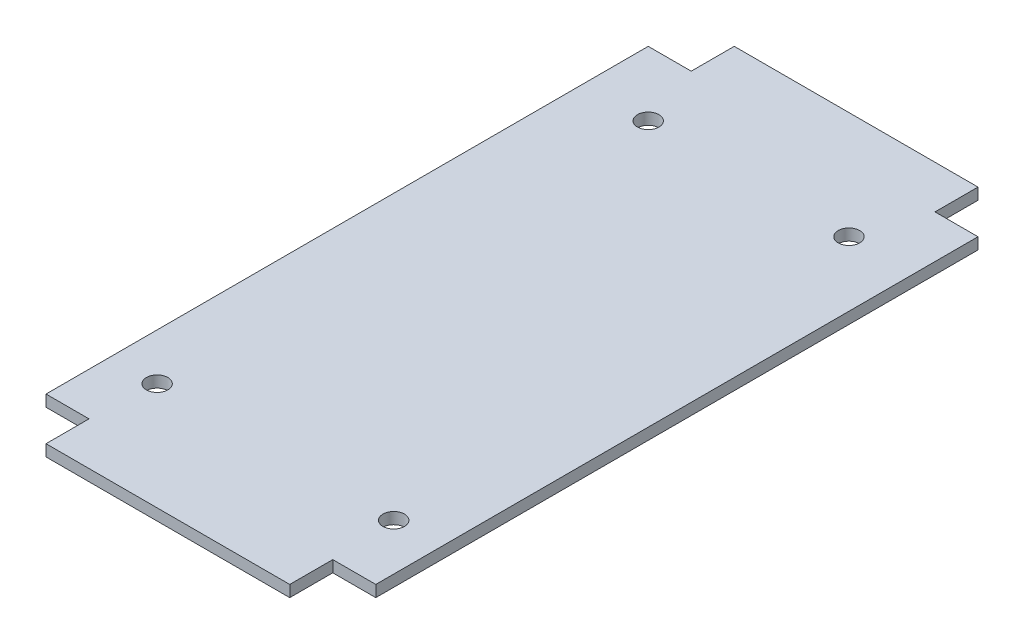
ISO-10303-21;
HEADER;
FILE_DESCRIPTION(('STEP AP214'),'2;1');
FILE_NAME('part.step','',(''),(''),'','','');
FILE_SCHEMA(('AUTOMOTIVE_DESIGN { 1 0 10303 214 1 1 1 1 }'));
ENDSEC;
DATA;
#1=APPLICATION_CONTEXT('core data for automotive mechanical design processes');
#2=APPLICATION_PROTOCOL_DEFINITION('international standard','automotive_design',2000,#1);
#3=PRODUCT_CONTEXT('',#1,'mechanical');
#4=PRODUCT('Part','Part','',(#3));
#5=PRODUCT_RELATED_PRODUCT_CATEGORY('part','',(#4));
#6=PRODUCT_DEFINITION_FORMATION('','',#4);
#7=PRODUCT_DEFINITION_CONTEXT('part definition',#1,'design');
#8=PRODUCT_DEFINITION('design','',#6,#7);
#9=PRODUCT_DEFINITION_SHAPE('','',#8);
#10=(LENGTH_UNIT() NAMED_UNIT(*) SI_UNIT(.MILLI.,.METRE.));
#11=(NAMED_UNIT(*) PLANE_ANGLE_UNIT() SI_UNIT($,.RADIAN.));
#12=(NAMED_UNIT(*) SI_UNIT($,.STERADIAN.) SOLID_ANGLE_UNIT());
#13=UNCERTAINTY_MEASURE_WITH_UNIT(LENGTH_MEASURE(1.E-05),#10,'distance_accuracy_value','');
#14=(GEOMETRIC_REPRESENTATION_CONTEXT(3) GLOBAL_UNCERTAINTY_ASSIGNED_CONTEXT((#13)) GLOBAL_UNIT_ASSIGNED_CONTEXT((#10,
#11,#12)) REPRESENTATION_CONTEXT('',''));
#15=CARTESIAN_POINT('',(0.,0.,0.));
#16=DIRECTION('',(0.,0.,1.));
#17=DIRECTION('',(1.,0.,0.));
#18=AXIS2_PLACEMENT_3D('',#15,#16,#17);
#19=CARTESIAN_POINT('',(17.,0.,-42.));
#20=DIRECTION('',(0.,-1.,0.));
#21=DIRECTION('',(0.,0.,-1.));
#22=AXIS2_PLACEMENT_3D('',#19,#20,#21);
#23=PLANE('',#22);
#24=DIRECTION('',(0.,0.,-1.));
#25=VECTOR('',#24,1.);
#26=CARTESIAN_POINT('',(17.,0.,-42.));
#27=LINE('',#26,#25);
#28=CARTESIAN_POINT('',(17.,0.,-48.));
#29=VERTEX_POINT('',#28);
#30=CARTESIAN_POINT('',(17.,0.,-42.));
#31=VERTEX_POINT('',#30);
#32=EDGE_CURVE('E367',#29,#31,#27,.F.);
#33=ORIENTED_EDGE('',*,*,#32,.F.);
#34=DIRECTION('',(-1.,0.,0.));
#35=VECTOR('',#34,1.);
#36=CARTESIAN_POINT('',(-17.,0.,-48.));
#37=LINE('',#36,#35);
#38=CARTESIAN_POINT('',(-17.,0.,-48.));
#39=VERTEX_POINT('',#38);
#40=EDGE_CURVE('E372',#39,#29,#37,.F.);
#41=ORIENTED_EDGE('',*,*,#40,.F.);
#42=DIRECTION('',(0.,0.,1.));
#43=VECTOR('',#42,1.);
#44=CARTESIAN_POINT('',(-17.,0.,-42.));
#45=LINE('',#44,#43);
#46=CARTESIAN_POINT('',(-17.,0.,-42.));
#47=VERTEX_POINT('',#46);
#48=EDGE_CURVE('E377',#47,#39,#45,.F.);
#49=ORIENTED_EDGE('',*,*,#48,.F.);
#50=DIRECTION('',(-1.,0.,0.));
#51=VECTOR('',#50,1.);
#52=CARTESIAN_POINT('',(-23.,0.,-42.));
#53=LINE('',#52,#51);
#54=CARTESIAN_POINT('',(-23.,0.,-42.));
#55=VERTEX_POINT('',#54);
#56=EDGE_CURVE('E383',#55,#47,#53,.F.);
#57=ORIENTED_EDGE('',*,*,#56,.F.);
#58=DIRECTION('',(0.,0.,1.));
#59=VECTOR('',#58,1.);
#60=CARTESIAN_POINT('',(-23.,0.,-42.));
#61=LINE('',#60,#59);
#62=CARTESIAN_POINT('',(-23.,0.,42.));
#63=VERTEX_POINT('',#62);
#64=EDGE_CURVE('E389',#63,#55,#61,.F.);
#65=ORIENTED_EDGE('',*,*,#64,.F.);
#66=DIRECTION('',(1.,0.,0.));
#67=VECTOR('',#66,1.);
#68=CARTESIAN_POINT('',(-23.,0.,42.));
#69=LINE('',#68,#67);
#70=CARTESIAN_POINT('',(-17.,0.,42.));
#71=VERTEX_POINT('',#70);
#72=EDGE_CURVE('E395',#71,#63,#69,.F.);
#73=ORIENTED_EDGE('',*,*,#72,.F.);
#74=DIRECTION('',(0.,0.,1.));
#75=VECTOR('',#74,1.);
#76=CARTESIAN_POINT('',(-17.,0.,42.));
#77=LINE('',#76,#75);
#78=CARTESIAN_POINT('',(-17.,0.,48.));
#79=VERTEX_POINT('',#78);
#80=EDGE_CURVE('E401',#79,#71,#77,.F.);
#81=ORIENTED_EDGE('',*,*,#80,.F.);
#82=DIRECTION('',(1.,0.,0.));
#83=VECTOR('',#82,1.);
#84=CARTESIAN_POINT('',(-17.,0.,48.));
#85=LINE('',#84,#83);
#86=CARTESIAN_POINT('',(17.,0.,48.));
#87=VERTEX_POINT('',#86);
#88=EDGE_CURVE('E407',#87,#79,#85,.F.);
#89=ORIENTED_EDGE('',*,*,#88,.F.);
#90=DIRECTION('',(0.,0.,-1.));
#91=VECTOR('',#90,1.);
#92=CARTESIAN_POINT('',(17.,0.,42.));
#93=LINE('',#92,#91);
#94=CARTESIAN_POINT('',(17.,0.,42.));
#95=VERTEX_POINT('',#94);
#96=EDGE_CURVE('E411',#95,#87,#93,.F.);
#97=ORIENTED_EDGE('',*,*,#96,.F.);
#98=DIRECTION('',(1.,0.,0.));
#99=VECTOR('',#98,1.);
#100=CARTESIAN_POINT('',(23.,0.,42.));
#101=LINE('',#100,#99);
#102=CARTESIAN_POINT('',(23.,0.,42.));
#103=VERTEX_POINT('',#102);
#104=EDGE_CURVE('E104',#103,#95,#101,.F.);
#105=ORIENTED_EDGE('',*,*,#104,.F.);
#106=DIRECTION('',(0.,0.,-1.));
#107=VECTOR('',#106,1.);
#108=CARTESIAN_POINT('',(23.,0.,-42.));
#109=LINE('',#108,#107);
#110=CARTESIAN_POINT('',(23.,0.,-42.));
#111=VERTEX_POINT('',#110);
#112=EDGE_CURVE('E106',#111,#103,#109,.F.);
#113=ORIENTED_EDGE('',*,*,#112,.F.);
#114=DIRECTION('',(-1.,0.,0.));
#115=VECTOR('',#114,1.);
#116=CARTESIAN_POINT('',(23.,0.,-42.));
#117=LINE('',#116,#115);
#118=EDGE_CURVE('E109',#31,#111,#117,.F.);
#119=ORIENTED_EDGE('',*,*,#118,.F.);
#120=EDGE_LOOP('',(#33,#41,#49,#57,#65,#73,#81,#89,#97,#105,#113,#119));
#121=FACE_BOUND('',#120,.T.);
#122=CARTESIAN_POINT('',(-14.,0.,-33.));
#123=DIRECTION('',(0.,1.,0.));
#124=DIRECTION('',(0.,0.,1.));
#125=AXIS2_PLACEMENT_3D('',#122,#123,#124);
#126=CIRCLE('',#125,1.5);
#127=CARTESIAN_POINT('',(-14.,0.,-31.5));
#128=VERTEX_POINT('',#127);
#129=EDGE_CURVE('E122',#128,#128,#126,.F.);
#130=ORIENTED_EDGE('',*,*,#129,.T.);
#131=EDGE_LOOP('',(#130));
#132=FACE_BOUND('',#131,.T.);
#133=CARTESIAN_POINT('',(-16.5,0.,33.));
#134=DIRECTION('',(0.,1.,0.));
#135=DIRECTION('',(0.,0.,1.));
#136=AXIS2_PLACEMENT_3D('',#133,#134,#135);
#137=CIRCLE('',#136,1.5);
#138=CARTESIAN_POINT('',(-16.5,0.,34.5));
#139=VERTEX_POINT('',#138);
#140=EDGE_CURVE('E148',#139,#139,#137,.F.);
#141=ORIENTED_EDGE('',*,*,#140,.T.);
#142=EDGE_LOOP('',(#141));
#143=FACE_BOUND('',#142,.T.);
#144=CARTESIAN_POINT('',(16.5,0.,33.));
#145=DIRECTION('',(0.,1.,0.));
#146=DIRECTION('',(0.,0.,1.));
#147=AXIS2_PLACEMENT_3D('',#144,#145,#146);
#148=CIRCLE('',#147,1.5);
#149=CARTESIAN_POINT('',(16.5,0.,34.5));
#150=VERTEX_POINT('',#149);
#151=EDGE_CURVE('E150',#150,#150,#148,.F.);
#152=ORIENTED_EDGE('',*,*,#151,.T.);
#153=EDGE_LOOP('',(#152));
#154=FACE_BOUND('',#153,.T.);
#155=CARTESIAN_POINT('',(14.,0.,-33.));
#156=DIRECTION('',(0.,1.,0.));
#157=DIRECTION('',(0.,0.,1.));
#158=AXIS2_PLACEMENT_3D('',#155,#156,#157);
#159=CIRCLE('',#158,1.5);
#160=CARTESIAN_POINT('',(14.,0.,-31.5));
#161=VERTEX_POINT('',#160);
#162=EDGE_CURVE('E20',#161,#161,#159,.F.);
#163=ORIENTED_EDGE('',*,*,#162,.T.);
#164=EDGE_LOOP('',(#163));
#165=FACE_BOUND('',#164,.T.);
#166=ADVANCED_FACE('F17',(#121,#132,#143,#154,#165),#23,.F.);
#167=CARTESIAN_POINT('',(14.,-1.6,-33.));
#168=DIRECTION('',(0.,1.,0.));
#169=DIRECTION('',(0.,0.,1.));
#170=AXIS2_PLACEMENT_3D('',#167,#168,#169);
#171=CYLINDRICAL_SURFACE('',#170,1.5);
#172=ORIENTED_EDGE('',*,*,#162,.F.);
#173=EDGE_LOOP('',(#172));
#174=FACE_BOUND('',#173,.T.);
#175=CARTESIAN_POINT('',(14.,-1.6,-33.));
#176=DIRECTION('',(0.,1.,0.));
#177=DIRECTION('',(0.,0.,1.));
#178=AXIS2_PLACEMENT_3D('',#175,#176,#177);
#179=CIRCLE('',#178,1.5);
#180=CARTESIAN_POINT('',(14.,-1.6,-31.5));
#181=VERTEX_POINT('',#180);
#182=EDGE_CURVE('E143',#181,#181,#179,.T.);
#183=ORIENTED_EDGE('',*,*,#182,.F.);
#184=EDGE_LOOP('',(#183));
#185=FACE_BOUND('',#184,.T.);
#186=ADVANCED_FACE('F158',(#174,#185),#171,.F.);
#187=CARTESIAN_POINT('',(16.5,-1.6,33.));
#188=DIRECTION('',(0.,1.,0.));
#189=DIRECTION('',(0.,0.,1.));
#190=AXIS2_PLACEMENT_3D('',#187,#188,#189);
#191=CYLINDRICAL_SURFACE('',#190,1.5);
#192=ORIENTED_EDGE('',*,*,#151,.F.);
#193=EDGE_LOOP('',(#192));
#194=FACE_BOUND('',#193,.T.);
#195=CARTESIAN_POINT('',(16.5,-1.6,33.));
#196=DIRECTION('',(0.,1.,0.));
#197=DIRECTION('',(0.,0.,1.));
#198=AXIS2_PLACEMENT_3D('',#195,#196,#197);
#199=CIRCLE('',#198,1.5);
#200=CARTESIAN_POINT('',(16.5,-1.6,34.5));
#201=VERTEX_POINT('',#200);
#202=EDGE_CURVE('E140',#201,#201,#199,.T.);
#203=ORIENTED_EDGE('',*,*,#202,.F.);
#204=EDGE_LOOP('',(#203));
#205=FACE_BOUND('',#204,.T.);
#206=ADVANCED_FACE('F161',(#194,#205),#191,.F.);
#207=CARTESIAN_POINT('',(-16.5,-1.6,33.));
#208=DIRECTION('',(0.,1.,0.));
#209=DIRECTION('',(0.,0.,1.));
#210=AXIS2_PLACEMENT_3D('',#207,#208,#209);
#211=CYLINDRICAL_SURFACE('',#210,1.5);
#212=ORIENTED_EDGE('',*,*,#140,.F.);
#213=EDGE_LOOP('',(#212));
#214=FACE_BOUND('',#213,.T.);
#215=CARTESIAN_POINT('',(-16.5,-1.6,33.));
#216=DIRECTION('',(0.,1.,0.));
#217=DIRECTION('',(0.,0.,1.));
#218=AXIS2_PLACEMENT_3D('',#215,#216,#217);
#219=CIRCLE('',#218,1.5);
#220=CARTESIAN_POINT('',(-16.5,-1.6,34.5));
#221=VERTEX_POINT('',#220);
#222=EDGE_CURVE('E137',#221,#221,#219,.T.);
#223=ORIENTED_EDGE('',*,*,#222,.F.);
#224=EDGE_LOOP('',(#223));
#225=FACE_BOUND('',#224,.T.);
#226=ADVANCED_FACE('F220',(#214,#225),#211,.F.);
#227=CARTESIAN_POINT('',(-14.,-1.6,-33.));
#228=DIRECTION('',(0.,1.,0.));
#229=DIRECTION('',(0.,0.,1.));
#230=AXIS2_PLACEMENT_3D('',#227,#228,#229);
#231=CYLINDRICAL_SURFACE('',#230,1.5);
#232=ORIENTED_EDGE('',*,*,#129,.F.);
#233=EDGE_LOOP('',(#232));
#234=FACE_BOUND('',#233,.T.);
#235=CARTESIAN_POINT('',(-14.,-1.6,-33.));
#236=DIRECTION('',(0.,1.,0.));
#237=DIRECTION('',(0.,0.,1.));
#238=AXIS2_PLACEMENT_3D('',#235,#236,#237);
#239=CIRCLE('',#238,1.5);
#240=CARTESIAN_POINT('',(-14.,-1.6,-31.5));
#241=VERTEX_POINT('',#240);
#242=EDGE_CURVE('E133',#241,#241,#239,.T.);
#243=ORIENTED_EDGE('',*,*,#242,.F.);
#244=EDGE_LOOP('',(#243));
#245=FACE_BOUND('',#244,.T.);
#246=ADVANCED_FACE('F217',(#234,#245),#231,.F.);
#247=CARTESIAN_POINT('',(23.,-1.6,-42.));
#248=DIRECTION('',(0.,0.,-1.));
#249=DIRECTION('',(-1.,0.,0.));
#250=AXIS2_PLACEMENT_3D('',#247,#248,#249);
#251=PLANE('',#250);
#252=DIRECTION('',(1.,0.,0.));
#253=VECTOR('',#252,1.);
#254=CARTESIAN_POINT('',(17.,-1.6,-42.));
#255=LINE('',#254,#253);
#256=CARTESIAN_POINT('',(17.,-1.6,-42.));
#257=VERTEX_POINT('',#256);
#258=CARTESIAN_POINT('',(23.,-1.6,-42.));
#259=VERTEX_POINT('',#258);
#260=EDGE_CURVE('E136',#257,#259,#255,.T.);
#261=ORIENTED_EDGE('',*,*,#260,.F.);
#262=DIRECTION('',(0.,1.,0.));
#263=VECTOR('',#262,1.);
#264=CARTESIAN_POINT('',(17.,-1.6,-42.));
#265=LINE('',#264,#263);
#266=EDGE_CURVE('E120',#31,#257,#265,.F.);
#267=ORIENTED_EDGE('',*,*,#266,.F.);
#268=ORIENTED_EDGE('',*,*,#118,.T.);
#269=DIRECTION('',(0.,1.,0.));
#270=VECTOR('',#269,1.);
#271=CARTESIAN_POINT('',(23.,-1.6,-42.));
#272=LINE('',#271,#270);
#273=EDGE_CURVE('E114',#259,#111,#272,.T.);
#274=ORIENTED_EDGE('',*,*,#273,.F.);
#275=EDGE_LOOP('',(#261,#267,#268,#274));
#276=FACE_BOUND('',#275,.T.);
#277=ADVANCED_FACE('F117',(#276),#251,.T.);
#278=CARTESIAN_POINT('',(23.,-1.6,-42.));
#279=DIRECTION('',(1.,0.,0.));
#280=DIRECTION('',(0.,0.,-1.));
#281=AXIS2_PLACEMENT_3D('',#278,#279,#280);
#282=PLANE('',#281);
#283=DIRECTION('',(0.,0.,-1.));
#284=VECTOR('',#283,1.);
#285=CARTESIAN_POINT('',(23.,-1.6,-42.));
#286=LINE('',#285,#284);
#287=CARTESIAN_POINT('',(23.,-1.6,42.));
#288=VERTEX_POINT('',#287);
#289=EDGE_CURVE('E126',#259,#288,#286,.F.);
#290=ORIENTED_EDGE('',*,*,#289,.F.);
#291=ORIENTED_EDGE('',*,*,#273,.T.);
#292=ORIENTED_EDGE('',*,*,#112,.T.);
#293=DIRECTION('',(0.,1.,0.));
#294=VECTOR('',#293,1.);
#295=CARTESIAN_POINT('',(23.,-1.6,42.));
#296=LINE('',#295,#294);
#297=EDGE_CURVE('E129',#288,#103,#296,.T.);
#298=ORIENTED_EDGE('',*,*,#297,.F.);
#299=EDGE_LOOP('',(#290,#291,#292,#298));
#300=FACE_BOUND('',#299,.T.);
#301=ADVANCED_FACE('F124',(#300),#282,.T.);
#302=CARTESIAN_POINT('',(23.,-1.6,42.));
#303=DIRECTION('',(0.,0.,1.));
#304=DIRECTION('',(1.,0.,0.));
#305=AXIS2_PLACEMENT_3D('',#302,#303,#304);
#306=PLANE('',#305);
#307=DIRECTION('',(1.,0.,0.));
#308=VECTOR('',#307,1.);
#309=CARTESIAN_POINT('',(17.,-1.6,42.));
#310=LINE('',#309,#308);
#311=CARTESIAN_POINT('',(17.,-1.6,42.));
#312=VERTEX_POINT('',#311);
#313=EDGE_CURVE('E354',#288,#312,#310,.F.);
#314=ORIENTED_EDGE('',*,*,#313,.F.);
#315=ORIENTED_EDGE('',*,*,#297,.T.);
#316=ORIENTED_EDGE('',*,*,#104,.T.);
#317=DIRECTION('',(0.,1.,0.));
#318=VECTOR('',#317,1.);
#319=CARTESIAN_POINT('',(17.,-1.6,42.));
#320=LINE('',#319,#318);
#321=EDGE_CURVE('E356',#312,#95,#320,.T.);
#322=ORIENTED_EDGE('',*,*,#321,.F.);
#323=EDGE_LOOP('',(#314,#315,#316,#322));
#324=FACE_BOUND('',#323,.T.);
#325=ADVANCED_FACE('F208',(#324),#306,.T.);
#326=CARTESIAN_POINT('',(17.,-1.6,42.));
#327=DIRECTION('',(1.,0.,0.));
#328=DIRECTION('',(0.,0.,-1.));
#329=AXIS2_PLACEMENT_3D('',#326,#327,#328);
#330=PLANE('',#329);
#331=DIRECTION('',(0.,0.,-1.));
#332=VECTOR('',#331,1.);
#333=CARTESIAN_POINT('',(17.,-1.6,-42.));
#334=LINE('',#333,#332);
#335=CARTESIAN_POINT('',(17.,-1.6,48.));
#336=VERTEX_POINT('',#335);
#337=EDGE_CURVE('E359',#312,#336,#334,.F.);
#338=ORIENTED_EDGE('',*,*,#337,.F.);
#339=ORIENTED_EDGE('',*,*,#321,.T.);
#340=ORIENTED_EDGE('',*,*,#96,.T.);
#341=DIRECTION('',(0.,1.,0.));
#342=VECTOR('',#341,1.);
#343=CARTESIAN_POINT('',(17.,-1.6,48.));
#344=LINE('',#343,#342);
#345=EDGE_CURVE('E404',#336,#87,#344,.T.);
#346=ORIENTED_EDGE('',*,*,#345,.F.);
#347=EDGE_LOOP('',(#338,#339,#340,#346));
#348=FACE_BOUND('',#347,.T.);
#349=ADVANCED_FACE('F204',(#348),#330,.T.);
#350=CARTESIAN_POINT('',(-17.,-1.6,48.));
#351=DIRECTION('',(0.,0.,1.));
#352=DIRECTION('',(1.,0.,0.));
#353=AXIS2_PLACEMENT_3D('',#350,#351,#352);
#354=PLANE('',#353);
#355=DIRECTION('',(1.,0.,0.));
#356=VECTOR('',#355,1.);
#357=CARTESIAN_POINT('',(17.,-1.6,48.));
#358=LINE('',#357,#356);
#359=CARTESIAN_POINT('',(-17.,-1.6,48.));
#360=VERTEX_POINT('',#359);
#361=EDGE_CURVE('E415',#336,#360,#358,.F.);
#362=ORIENTED_EDGE('',*,*,#361,.F.);
#363=ORIENTED_EDGE('',*,*,#345,.T.);
#364=ORIENTED_EDGE('',*,*,#88,.T.);
#365=DIRECTION('',(0.,1.,0.));
#366=VECTOR('',#365,1.);
#367=CARTESIAN_POINT('',(-17.,-1.6,48.));
#368=LINE('',#367,#366);
#369=EDGE_CURVE('E398',#360,#79,#368,.T.);
#370=ORIENTED_EDGE('',*,*,#369,.F.);
#371=EDGE_LOOP('',(#362,#363,#364,#370));
#372=FACE_BOUND('',#371,.T.);
#373=ADVANCED_FACE('F200',(#372),#354,.T.);
#374=CARTESIAN_POINT('',(-17.,-1.6,42.));
#375=DIRECTION('',(-1.,0.,0.));
#376=DIRECTION('',(0.,0.,1.));
#377=AXIS2_PLACEMENT_3D('',#374,#375,#376);
#378=PLANE('',#377);
#379=DIRECTION('',(0.,0.,-1.));
#380=VECTOR('',#379,1.);
#381=CARTESIAN_POINT('',(-17.,-1.6,-42.));
#382=LINE('',#381,#380);
#383=CARTESIAN_POINT('',(-17.,-1.6,42.));
#384=VERTEX_POINT('',#383);
#385=EDGE_CURVE('E418',#360,#384,#382,.T.);
#386=ORIENTED_EDGE('',*,*,#385,.F.);
#387=ORIENTED_EDGE('',*,*,#369,.T.);
#388=ORIENTED_EDGE('',*,*,#80,.T.);
#389=DIRECTION('',(0.,1.,0.));
#390=VECTOR('',#389,1.);
#391=CARTESIAN_POINT('',(-17.,-1.6,42.));
#392=LINE('',#391,#390);
#393=EDGE_CURVE('E392',#384,#71,#392,.T.);
#394=ORIENTED_EDGE('',*,*,#393,.F.);
#395=EDGE_LOOP('',(#386,#387,#388,#394));
#396=FACE_BOUND('',#395,.T.);
#397=ADVANCED_FACE('F196',(#396),#378,.T.);
#398=CARTESIAN_POINT('',(-23.,-1.6,42.));
#399=DIRECTION('',(0.,0.,1.));
#400=DIRECTION('',(1.,0.,0.));
#401=AXIS2_PLACEMENT_3D('',#398,#399,#400);
#402=PLANE('',#401);
#403=DIRECTION('',(1.,0.,0.));
#404=VECTOR('',#403,1.);
#405=CARTESIAN_POINT('',(17.,-1.6,42.));
#406=LINE('',#405,#404);
#407=CARTESIAN_POINT('',(-23.,-1.6,42.));
#408=VERTEX_POINT('',#407);
#409=EDGE_CURVE('E422',#384,#408,#406,.F.);
#410=ORIENTED_EDGE('',*,*,#409,.F.);
#411=ORIENTED_EDGE('',*,*,#393,.T.);
#412=ORIENTED_EDGE('',*,*,#72,.T.);
#413=DIRECTION('',(0.,1.,0.));
#414=VECTOR('',#413,1.);
#415=CARTESIAN_POINT('',(-23.,-1.6,42.));
#416=LINE('',#415,#414);
#417=EDGE_CURVE('E386',#408,#63,#416,.T.);
#418=ORIENTED_EDGE('',*,*,#417,.F.);
#419=EDGE_LOOP('',(#410,#411,#412,#418));
#420=FACE_BOUND('',#419,.T.);
#421=ADVANCED_FACE('F192',(#420),#402,.T.);
#422=CARTESIAN_POINT('',(-23.,-1.6,-42.));
#423=DIRECTION('',(-1.,0.,0.));
#424=DIRECTION('',(0.,0.,1.));
#425=AXIS2_PLACEMENT_3D('',#422,#423,#424);
#426=PLANE('',#425);
#427=DIRECTION('',(0.,0.,-1.));
#428=VECTOR('',#427,1.);
#429=CARTESIAN_POINT('',(-23.,-1.6,-42.));
#430=LINE('',#429,#428);
#431=CARTESIAN_POINT('',(-23.,-1.6,-42.));
#432=VERTEX_POINT('',#431);
#433=EDGE_CURVE('E425',#408,#432,#430,.T.);
#434=ORIENTED_EDGE('',*,*,#433,.F.);
#435=ORIENTED_EDGE('',*,*,#417,.T.);
#436=ORIENTED_EDGE('',*,*,#64,.T.);
#437=DIRECTION('',(0.,1.,0.));
#438=VECTOR('',#437,1.);
#439=CARTESIAN_POINT('',(-23.,-1.6,-42.));
#440=LINE('',#439,#438);
#441=EDGE_CURVE('E380',#432,#55,#440,.T.);
#442=ORIENTED_EDGE('',*,*,#441,.F.);
#443=EDGE_LOOP('',(#434,#435,#436,#442));
#444=FACE_BOUND('',#443,.T.);
#445=ADVANCED_FACE('F188',(#444),#426,.T.);
#446=CARTESIAN_POINT('',(-23.,-1.6,-42.));
#447=DIRECTION('',(0.,0.,-1.));
#448=DIRECTION('',(-1.,0.,0.));
#449=AXIS2_PLACEMENT_3D('',#446,#447,#448);
#450=PLANE('',#449);
#451=DIRECTION('',(1.,0.,0.));
#452=VECTOR('',#451,1.);
#453=CARTESIAN_POINT('',(17.,-1.6,-42.));
#454=LINE('',#453,#452);
#455=CARTESIAN_POINT('',(-17.,-1.6,-42.));
#456=VERTEX_POINT('',#455);
#457=EDGE_CURVE('E428',#432,#456,#454,.T.);
#458=ORIENTED_EDGE('',*,*,#457,.F.);
#459=ORIENTED_EDGE('',*,*,#441,.T.);
#460=ORIENTED_EDGE('',*,*,#56,.T.);
#461=DIRECTION('',(0.,1.,0.));
#462=VECTOR('',#461,1.);
#463=CARTESIAN_POINT('',(-17.,-1.6,-42.));
#464=LINE('',#463,#462);
#465=EDGE_CURVE('E374',#456,#47,#464,.T.);
#466=ORIENTED_EDGE('',*,*,#465,.F.);
#467=EDGE_LOOP('',(#458,#459,#460,#466));
#468=FACE_BOUND('',#467,.T.);
#469=ADVANCED_FACE('F184',(#468),#450,.T.);
#470=CARTESIAN_POINT('',(-17.,-1.6,-42.));
#471=DIRECTION('',(-1.,0.,0.));
#472=DIRECTION('',(0.,0.,1.));
#473=AXIS2_PLACEMENT_3D('',#470,#471,#472);
#474=PLANE('',#473);
#475=DIRECTION('',(0.,0.,-1.));
#476=VECTOR('',#475,1.);
#477=CARTESIAN_POINT('',(-17.,-1.6,-42.));
#478=LINE('',#477,#476);
#479=CARTESIAN_POINT('',(-17.,-1.6,-48.));
#480=VERTEX_POINT('',#479);
#481=EDGE_CURVE('E431',#456,#480,#478,.T.);
#482=ORIENTED_EDGE('',*,*,#481,.F.);
#483=ORIENTED_EDGE('',*,*,#465,.T.);
#484=ORIENTED_EDGE('',*,*,#48,.T.);
#485=DIRECTION('',(0.,1.,0.));
#486=VECTOR('',#485,1.);
#487=CARTESIAN_POINT('',(-17.,-1.6,-48.));
#488=LINE('',#487,#486);
#489=EDGE_CURVE('E369',#480,#39,#488,.T.);
#490=ORIENTED_EDGE('',*,*,#489,.F.);
#491=EDGE_LOOP('',(#482,#483,#484,#490));
#492=FACE_BOUND('',#491,.T.);
#493=ADVANCED_FACE('F181',(#492),#474,.T.);
#494=CARTESIAN_POINT('',(-17.,-1.6,-48.));
#495=DIRECTION('',(0.,0.,-1.));
#496=DIRECTION('',(-1.,0.,0.));
#497=AXIS2_PLACEMENT_3D('',#494,#495,#496);
#498=PLANE('',#497);
#499=DIRECTION('',(1.,0.,0.));
#500=VECTOR('',#499,1.);
#501=CARTESIAN_POINT('',(17.,-1.6,-48.));
#502=LINE('',#501,#500);
#503=CARTESIAN_POINT('',(17.,-1.6,-48.));
#504=VERTEX_POINT('',#503);
#505=EDGE_CURVE('E26',#480,#504,#502,.T.);
#506=ORIENTED_EDGE('',*,*,#505,.F.);
#507=ORIENTED_EDGE('',*,*,#489,.T.);
#508=ORIENTED_EDGE('',*,*,#40,.T.);
#509=DIRECTION('',(0.,1.,0.));
#510=VECTOR('',#509,1.);
#511=CARTESIAN_POINT('',(17.,-1.6,-48.));
#512=LINE('',#511,#510);
#513=EDGE_CURVE('E35',#504,#29,#512,.T.);
#514=ORIENTED_EDGE('',*,*,#513,.F.);
#515=EDGE_LOOP('',(#506,#507,#508,#514));
#516=FACE_BOUND('',#515,.T.);
#517=ADVANCED_FACE('F173',(#516),#498,.T.);
#518=CARTESIAN_POINT('',(17.,-1.6,-42.));
#519=DIRECTION('',(1.,0.,0.));
#520=DIRECTION('',(0.,0.,-1.));
#521=AXIS2_PLACEMENT_3D('',#518,#519,#520);
#522=PLANE('',#521);
#523=DIRECTION('',(0.,0.,-1.));
#524=VECTOR('',#523,1.);
#525=CARTESIAN_POINT('',(17.,-1.6,-42.));
#526=LINE('',#525,#524);
#527=EDGE_CURVE('E11',#504,#257,#526,.F.);
#528=ORIENTED_EDGE('',*,*,#527,.F.);
#529=ORIENTED_EDGE('',*,*,#513,.T.);
#530=ORIENTED_EDGE('',*,*,#32,.T.);
#531=ORIENTED_EDGE('',*,*,#266,.T.);
#532=EDGE_LOOP('',(#528,#529,#530,#531));
#533=FACE_BOUND('',#532,.T.);
#534=ADVANCED_FACE('F166',(#533),#522,.T.);
#535=CARTESIAN_POINT('',(17.,-1.6,-42.));
#536=DIRECTION('',(0.,-1.,0.));
#537=DIRECTION('',(0.,0.,-1.));
#538=AXIS2_PLACEMENT_3D('',#535,#536,#537);
#539=PLANE('',#538);
#540=ORIENTED_EDGE('',*,*,#505,.T.);
#541=ORIENTED_EDGE('',*,*,#527,.T.);
#542=ORIENTED_EDGE('',*,*,#260,.T.);
#543=ORIENTED_EDGE('',*,*,#289,.T.);
#544=ORIENTED_EDGE('',*,*,#313,.T.);
#545=ORIENTED_EDGE('',*,*,#337,.T.);
#546=ORIENTED_EDGE('',*,*,#361,.T.);
#547=ORIENTED_EDGE('',*,*,#385,.T.);
#548=ORIENTED_EDGE('',*,*,#409,.T.);
#549=ORIENTED_EDGE('',*,*,#433,.T.);
#550=ORIENTED_EDGE('',*,*,#457,.T.);
#551=ORIENTED_EDGE('',*,*,#481,.T.);
#552=EDGE_LOOP('',(#540,#541,#542,#543,#544,#545,#546,#547,#548,#549,#550,#551));
#553=FACE_BOUND('',#552,.T.);
#554=ORIENTED_EDGE('',*,*,#242,.T.);
#555=EDGE_LOOP('',(#554));
#556=FACE_BOUND('',#555,.T.);
#557=ORIENTED_EDGE('',*,*,#222,.T.);
#558=EDGE_LOOP('',(#557));
#559=FACE_BOUND('',#558,.T.);
#560=ORIENTED_EDGE('',*,*,#202,.T.);
#561=EDGE_LOOP('',(#560));
#562=FACE_BOUND('',#561,.T.);
#563=ORIENTED_EDGE('',*,*,#182,.T.);
#564=EDGE_LOOP('',(#563));
#565=FACE_BOUND('',#564,.T.);
#566=ADVANCED_FACE('F164',(#553,#556,#559,#562,#565),#539,.T.);
#567=CLOSED_SHELL('',(#166,#186,#206,#226,#246,#277,#301,#325,#349,#373,#397,#421,#445,#469,
#493,#517,#534,#566));
#568=MANIFOLD_SOLID_BREP('B1',#567);
#569=ADVANCED_BREP_SHAPE_REPRESENTATION('',(#18,#568),#14);
#570=SHAPE_DEFINITION_REPRESENTATION(#9,#569);
ENDSEC;
END-ISO-10303-21;
